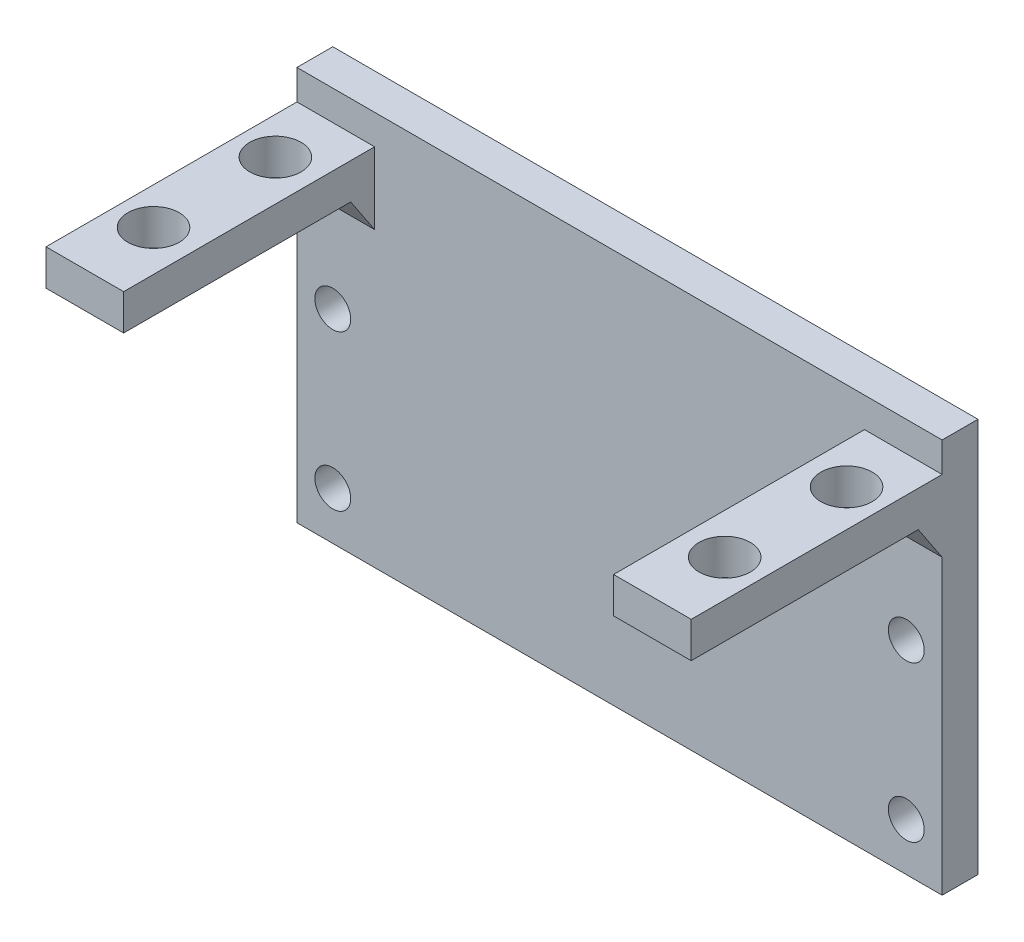
ISO-10303-21;
HEADER;
FILE_DESCRIPTION(('STEP AP214'),'2;1');
FILE_NAME('part.step','',(''),(''),'','','');
FILE_SCHEMA(('AUTOMOTIVE_DESIGN { 1 0 10303 214 1 1 1 1 }'));
ENDSEC;
DATA;
#1=APPLICATION_CONTEXT('core data for automotive mechanical design processes');
#2=APPLICATION_PROTOCOL_DEFINITION('international standard','automotive_design',2000,#1);
#3=PRODUCT_CONTEXT('',#1,'mechanical');
#4=PRODUCT('Part','Part','',(#3));
#5=PRODUCT_RELATED_PRODUCT_CATEGORY('part','',(#4));
#6=PRODUCT_DEFINITION_FORMATION('','',#4);
#7=PRODUCT_DEFINITION_CONTEXT('part definition',#1,'design');
#8=PRODUCT_DEFINITION('design','',#6,#7);
#9=PRODUCT_DEFINITION_SHAPE('','',#8);
#10=(LENGTH_UNIT() NAMED_UNIT(*) SI_UNIT(.MILLI.,.METRE.));
#11=(NAMED_UNIT(*) PLANE_ANGLE_UNIT() SI_UNIT($,.RADIAN.));
#12=(NAMED_UNIT(*) SI_UNIT($,.STERADIAN.) SOLID_ANGLE_UNIT());
#13=UNCERTAINTY_MEASURE_WITH_UNIT(LENGTH_MEASURE(1.E-05),#10,'distance_accuracy_value','');
#14=(GEOMETRIC_REPRESENTATION_CONTEXT(3) GLOBAL_UNCERTAINTY_ASSIGNED_CONTEXT((#13)) GLOBAL_UNIT_ASSIGNED_CONTEXT((#10,
#11,#12)) REPRESENTATION_CONTEXT('',''));
#15=CARTESIAN_POINT('',(0.,0.,0.));
#16=DIRECTION('',(0.,0.,1.));
#17=DIRECTION('',(1.,0.,0.));
#18=AXIS2_PLACEMENT_3D('',#15,#16,#17);
#19=CARTESIAN_POINT('',(0.,0.,3.));
#20=DIRECTION('',(0.,0.,1.));
#21=DIRECTION('',(1.,0.,0.));
#22=AXIS2_PLACEMENT_3D('',#19,#20,#21);
#23=PLANE('',#22);
#24=DIRECTION('',(-1.,0.,0.));
#25=VECTOR('',#24,1.);
#26=CARTESIAN_POINT('',(-9.45332964332359,0.892525525959512,3.));
#27=LINE('',#26,#25);
#28=CARTESIAN_POINT('',(-13.0588809187876,0.892525525959512,3.));
#29=VERTEX_POINT('',#28);
#30=CARTESIAN_POINT('',(-19.5588809187876,0.892525525959511,3.));
#31=VERTEX_POINT('',#30);
#32=EDGE_CURVE('E151',#29,#31,#27,.T.);
#33=ORIENTED_EDGE('',*,*,#32,.T.);
#34=DIRECTION('',(0.,-1.,0.));
#35=VECTOR('',#34,1.);
#36=CARTESIAN_POINT('',(-19.5588809187876,9.39252552595941,3.));
#37=LINE('',#36,#35);
#38=CARTESIAN_POINT('',(-19.5588809187876,-23.6074744740404,3.));
#39=VERTEX_POINT('',#38);
#40=EDGE_CURVE('E160',#31,#39,#37,.T.);
#41=ORIENTED_EDGE('',*,*,#40,.T.);
#42=DIRECTION('',(1.,0.,0.));
#43=VECTOR('',#42,1.);
#44=CARTESIAN_POINT('',(-19.5588809187876,-23.6074744740404,3.));
#45=LINE('',#44,#43);
#46=CARTESIAN_POINT('',(34.4411190812124,-23.6074744740404,3.));
#47=VERTEX_POINT('',#46);
#48=EDGE_CURVE('E207',#39,#47,#45,.T.);
#49=ORIENTED_EDGE('',*,*,#48,.T.);
#50=DIRECTION('',(0.,1.,0.));
#51=VECTOR('',#50,1.);
#52=CARTESIAN_POINT('',(34.4411190812124,9.39252552595941,3.));
#53=LINE('',#52,#51);
#54=CARTESIAN_POINT('',(34.4411190812124,0.892525525959515,3.));
#55=VERTEX_POINT('',#54);
#56=EDGE_CURVE('E60',#47,#55,#53,.T.);
#57=ORIENTED_EDGE('',*,*,#56,.T.);
#58=DIRECTION('',(1.,0.,0.));
#59=VECTOR('',#58,1.);
#60=CARTESIAN_POINT('',(24.3355678057484,0.892525525959516,3.));
#61=LINE('',#60,#59);
#62=CARTESIAN_POINT('',(27.9411190812124,0.892525525959518,3.));
#63=VERTEX_POINT('',#62);
#64=EDGE_CURVE('E351',#63,#55,#61,.T.);
#65=ORIENTED_EDGE('',*,*,#64,.F.);
#66=DIRECTION('',(0.,-1.,0.));
#67=VECTOR('',#66,1.);
#68=CARTESIAN_POINT('',(27.9411190812124,6.89252552595952,3.));
#69=LINE('',#68,#67);
#70=CARTESIAN_POINT('',(27.9411190812124,6.89252552595952,3.));
#71=VERTEX_POINT('',#70);
#72=EDGE_CURVE('E53',#71,#63,#69,.T.);
#73=ORIENTED_EDGE('',*,*,#72,.F.);
#74=DIRECTION('',(-1.,0.,0.));
#75=VECTOR('',#74,1.);
#76=CARTESIAN_POINT('',(34.4411190812124,6.89252552595952,3.));
#77=LINE('',#76,#75);
#78=CARTESIAN_POINT('',(34.4411190812124,6.89252552595952,3.));
#79=VERTEX_POINT('',#78);
#80=EDGE_CURVE('E181',#79,#71,#77,.T.);
#81=ORIENTED_EDGE('',*,*,#80,.F.);
#82=CARTESIAN_POINT('',(34.4411190812124,9.39252552595941,3.));
#83=VERTEX_POINT('',#82);
#84=EDGE_CURVE('E209',#79,#83,#53,.T.);
#85=ORIENTED_EDGE('',*,*,#84,.T.);
#86=DIRECTION('',(-1.,0.,0.));
#87=VECTOR('',#86,1.);
#88=CARTESIAN_POINT('',(-19.5588809187876,9.39252552595941,3.));
#89=LINE('',#88,#87);
#90=CARTESIAN_POINT('',(-19.5588809187876,9.39252552595941,3.));
#91=VERTEX_POINT('',#90);
#92=EDGE_CURVE('E211',#83,#91,#89,.T.);
#93=ORIENTED_EDGE('',*,*,#92,.T.);
#94=CARTESIAN_POINT('',(-19.5588809187876,6.89252552595951,3.));
#95=VERTEX_POINT('',#94);
#96=EDGE_CURVE('E205',#91,#95,#37,.T.);
#97=ORIENTED_EDGE('',*,*,#96,.T.);
#98=DIRECTION('',(-1.,0.,0.));
#99=VECTOR('',#98,1.);
#100=CARTESIAN_POINT('',(-19.5588809187876,6.89252552595951,3.));
#101=LINE('',#100,#99);
#102=CARTESIAN_POINT('',(-13.0588809187876,6.89252552595951,3.));
#103=VERTEX_POINT('',#102);
#104=EDGE_CURVE('E174',#103,#95,#101,.T.);
#105=ORIENTED_EDGE('',*,*,#104,.F.);
#106=DIRECTION('',(0.,1.,0.));
#107=VECTOR('',#106,1.);
#108=CARTESIAN_POINT('',(-13.0588809187876,6.89252552595951,3.));
#109=LINE('',#108,#107);
#110=EDGE_CURVE('E271',#29,#103,#109,.T.);
#111=ORIENTED_EDGE('',*,*,#110,.F.);
#112=EDGE_LOOP('',(#33,#41,#49,#57,#65,#73,#81,#85,#93,#97,#105,#111));
#113=FACE_BOUND('',#112,.T.);
#114=CARTESIAN_POINT('',(31.4411190812124,-6.60747447404044,3.));
#115=DIRECTION('',(0.,0.,1.));
#116=DIRECTION('',(1.,0.,0.));
#117=AXIS2_PLACEMENT_3D('',#114,#115,#116);
#118=CIRCLE('',#117,1.5);
#119=CARTESIAN_POINT('',(32.9411190812124,-6.60747447404044,3.));
#120=VERTEX_POINT('',#119);
#121=EDGE_CURVE('E364',#120,#120,#118,.T.);
#122=ORIENTED_EDGE('',*,*,#121,.F.);
#123=EDGE_LOOP('',(#122));
#124=FACE_BOUND('',#123,.T.);
#125=CARTESIAN_POINT('',(-16.5588809187876,-6.60747447404044,3.));
#126=DIRECTION('',(0.,0.,1.));
#127=DIRECTION('',(1.,0.,0.));
#128=AXIS2_PLACEMENT_3D('',#125,#126,#127);
#129=CIRCLE('',#128,1.5);
#130=CARTESIAN_POINT('',(-15.0588809187876,-6.60747447404044,3.));
#131=VERTEX_POINT('',#130);
#132=EDGE_CURVE('E362',#131,#131,#129,.T.);
#133=ORIENTED_EDGE('',*,*,#132,.F.);
#134=EDGE_LOOP('',(#133));
#135=FACE_BOUND('',#134,.T.);
#136=CARTESIAN_POINT('',(-16.5588809187876,-19.6074744740404,3.));
#137=DIRECTION('',(0.,0.,1.));
#138=DIRECTION('',(1.,0.,0.));
#139=AXIS2_PLACEMENT_3D('',#136,#137,#138);
#140=CIRCLE('',#139,1.5);
#141=CARTESIAN_POINT('',(-15.0588809187876,-19.6074744740404,3.));
#142=VERTEX_POINT('',#141);
#143=EDGE_CURVE('E359',#142,#142,#140,.T.);
#144=ORIENTED_EDGE('',*,*,#143,.F.);
#145=EDGE_LOOP('',(#144));
#146=FACE_BOUND('',#145,.T.);
#147=CARTESIAN_POINT('',(31.4411190812124,-19.6074744740404,3.));
#148=DIRECTION('',(0.,0.,1.));
#149=DIRECTION('',(1.,0.,0.));
#150=AXIS2_PLACEMENT_3D('',#147,#148,#149);
#151=CIRCLE('',#150,1.50000000000001);
#152=CARTESIAN_POINT('',(32.9411190812124,-19.6074744740404,3.));
#153=VERTEX_POINT('',#152);
#154=EDGE_CURVE('E233',#153,#153,#151,.T.);
#155=ORIENTED_EDGE('',*,*,#154,.F.);
#156=EDGE_LOOP('',(#155));
#157=FACE_BOUND('',#156,.T.);
#158=ADVANCED_FACE('F36',(#113,#124,#135,#146,#157),#23,.T.);
#159=CARTESIAN_POINT('',(-19.5588809187876,9.39252552595941,3.));
#160=DIRECTION('',(1.,0.,0.));
#161=DIRECTION('',(0.,1.,0.));
#162=AXIS2_PLACEMENT_3D('',#159,#160,#161);
#163=PLANE('',#162);
#164=ORIENTED_EDGE('',*,*,#40,.F.);
#165=DIRECTION('',(0.,0.832050294337844,0.554700196225229));
#166=VECTOR('',#165,1.);
#167=CARTESIAN_POINT('',(-19.5588809187876,0.892525525959511,3.));
#168=LINE('',#167,#166);
#169=CARTESIAN_POINT('',(-19.5588809187876,3.89252552595951,5.));
#170=VERTEX_POINT('',#169);
#171=EDGE_CURVE('E143',#31,#170,#168,.T.);
#172=ORIENTED_EDGE('',*,*,#171,.T.);
#173=DIRECTION('',(0.,0.,-1.));
#174=VECTOR('',#173,1.);
#175=CARTESIAN_POINT('',(-19.5588809187876,3.89252552595951,24.));
#176=LINE('',#175,#174);
#177=CARTESIAN_POINT('',(-19.5588809187876,3.89252552595951,24.));
#178=VERTEX_POINT('',#177);
#179=EDGE_CURVE('E157',#178,#170,#176,.T.);
#180=ORIENTED_EDGE('',*,*,#179,.F.);
#181=DIRECTION('',(0.,-1.,0.));
#182=VECTOR('',#181,1.);
#183=CARTESIAN_POINT('',(-19.5588809187876,3.89252552595951,24.));
#184=LINE('',#183,#182);
#185=CARTESIAN_POINT('',(-19.5588809187876,6.89252552595951,24.));
#186=VERTEX_POINT('',#185);
#187=EDGE_CURVE('E166',#186,#178,#184,.T.);
#188=ORIENTED_EDGE('',*,*,#187,.F.);
#189=DIRECTION('',(0.,0.,-1.));
#190=VECTOR('',#189,1.);
#191=CARTESIAN_POINT('',(-19.5588809187876,6.89252552595951,24.));
#192=LINE('',#191,#190);
#193=EDGE_CURVE('E165',#186,#95,#192,.T.);
#194=ORIENTED_EDGE('',*,*,#193,.T.);
#195=ORIENTED_EDGE('',*,*,#96,.F.);
#196=DIRECTION('',(0.,0.,-1.));
#197=VECTOR('',#196,1.);
#198=CARTESIAN_POINT('',(-19.5588809187876,9.39252552595941,3.));
#199=LINE('',#198,#197);
#200=CARTESIAN_POINT('',(-19.5588809187876,9.39252552595941,0.));
#201=VERTEX_POINT('',#200);
#202=EDGE_CURVE('E213',#91,#201,#199,.T.);
#203=ORIENTED_EDGE('',*,*,#202,.T.);
#204=DIRECTION('',(0.,-1.,0.));
#205=VECTOR('',#204,1.);
#206=CARTESIAN_POINT('',(-19.5588809187876,9.39252552595941,0.));
#207=LINE('',#206,#205);
#208=CARTESIAN_POINT('',(-19.5588809187876,-23.6074744740404,0.));
#209=VERTEX_POINT('',#208);
#210=EDGE_CURVE('E204',#201,#209,#207,.T.);
#211=ORIENTED_EDGE('',*,*,#210,.T.);
#212=DIRECTION('',(0.,0.,-1.));
#213=VECTOR('',#212,1.);
#214=CARTESIAN_POINT('',(-19.5588809187876,-23.6074744740404,3.));
#215=LINE('',#214,#213);
#216=EDGE_CURVE('E11',#39,#209,#215,.T.);
#217=ORIENTED_EDGE('',*,*,#216,.F.);
#218=EDGE_LOOP('',(#164,#172,#180,#188,#194,#195,#203,#211,#217));
#219=FACE_BOUND('',#218,.T.);
#220=ADVANCED_FACE('F38',(#219),#163,.F.);
#221=CARTESIAN_POINT('',(-19.5588809187876,-23.6074744740404,3.));
#222=DIRECTION('',(0.,1.,0.));
#223=DIRECTION('',(0.,0.,1.));
#224=AXIS2_PLACEMENT_3D('',#221,#222,#223);
#225=PLANE('',#224);
#226=DIRECTION('',(1.,0.,0.));
#227=VECTOR('',#226,1.);
#228=CARTESIAN_POINT('',(-19.5588809187876,-23.6074744740404,0.));
#229=LINE('',#228,#227);
#230=CARTESIAN_POINT('',(34.4411190812124,-23.6074744740404,0.));
#231=VERTEX_POINT('',#230);
#232=EDGE_CURVE('E216',#209,#231,#229,.T.);
#233=ORIENTED_EDGE('',*,*,#232,.T.);
#234=DIRECTION('',(0.,0.,-1.));
#235=VECTOR('',#234,1.);
#236=CARTESIAN_POINT('',(34.4411190812124,-23.6074744740404,3.));
#237=LINE('',#236,#235);
#238=EDGE_CURVE('E45',#47,#231,#237,.T.);
#239=ORIENTED_EDGE('',*,*,#238,.F.);
#240=ORIENTED_EDGE('',*,*,#48,.F.);
#241=ORIENTED_EDGE('',*,*,#216,.T.);
#242=EDGE_LOOP('',(#233,#239,#240,#241));
#243=FACE_BOUND('',#242,.T.);
#244=ADVANCED_FACE('F303',(#243),#225,.F.);
#245=CARTESIAN_POINT('',(34.4411190812124,9.39252552595941,3.));
#246=DIRECTION('',(-1.,0.,0.));
#247=DIRECTION('',(0.,-1.,0.));
#248=AXIS2_PLACEMENT_3D('',#245,#246,#247);
#249=PLANE('',#248);
#250=DIRECTION('',(0.,1.,0.));
#251=VECTOR('',#250,1.);
#252=CARTESIAN_POINT('',(34.4411190812124,9.39252552595941,0.));
#253=LINE('',#252,#251);
#254=CARTESIAN_POINT('',(34.4411190812124,9.39252552595941,0.));
#255=VERTEX_POINT('',#254);
#256=EDGE_CURVE('E218',#231,#255,#253,.T.);
#257=ORIENTED_EDGE('',*,*,#256,.T.);
#258=DIRECTION('',(0.,0.,-1.));
#259=VECTOR('',#258,1.);
#260=CARTESIAN_POINT('',(34.4411190812124,9.39252552595941,3.));
#261=LINE('',#260,#259);
#262=EDGE_CURVE('E224',#83,#255,#261,.T.);
#263=ORIENTED_EDGE('',*,*,#262,.F.);
#264=ORIENTED_EDGE('',*,*,#84,.F.);
#265=DIRECTION('',(0.,0.,-1.));
#266=VECTOR('',#265,1.);
#267=CARTESIAN_POINT('',(34.4411190812124,6.89252552595952,24.));
#268=LINE('',#267,#266);
#269=CARTESIAN_POINT('',(34.4411190812124,6.89252552595952,24.));
#270=VERTEX_POINT('',#269);
#271=EDGE_CURVE('E191',#270,#79,#268,.T.);
#272=ORIENTED_EDGE('',*,*,#271,.F.);
#273=DIRECTION('',(0.,1.,0.));
#274=VECTOR('',#273,1.);
#275=CARTESIAN_POINT('',(34.4411190812124,3.89252552595952,24.));
#276=LINE('',#275,#274);
#277=CARTESIAN_POINT('',(34.4411190812124,3.89252552595952,24.));
#278=VERTEX_POINT('',#277);
#279=EDGE_CURVE('E189',#278,#270,#276,.T.);
#280=ORIENTED_EDGE('',*,*,#279,.F.);
#281=DIRECTION('',(0.,0.,-1.));
#282=VECTOR('',#281,1.);
#283=CARTESIAN_POINT('',(34.4411190812124,3.89252552595952,24.));
#284=LINE('',#283,#282);
#285=CARTESIAN_POINT('',(34.4411190812124,3.89252552595952,5.));
#286=VERTEX_POINT('',#285);
#287=EDGE_CURVE('E197',#278,#286,#284,.T.);
#288=ORIENTED_EDGE('',*,*,#287,.T.);
#289=DIRECTION('',(0.,-0.832050294337843,-0.554700196225229));
#290=VECTOR('',#289,1.);
#291=CARTESIAN_POINT('',(34.4411190812124,0.892525525959518,3.));
#292=LINE('',#291,#290);
#293=EDGE_CURVE('E344',#286,#55,#292,.T.);
#294=ORIENTED_EDGE('',*,*,#293,.T.);
#295=ORIENTED_EDGE('',*,*,#56,.F.);
#296=ORIENTED_EDGE('',*,*,#238,.T.);
#297=EDGE_LOOP('',(#257,#263,#264,#272,#280,#288,#294,#295,#296));
#298=FACE_BOUND('',#297,.T.);
#299=ADVANCED_FACE('F315',(#298),#249,.F.);
#300=CARTESIAN_POINT('',(-19.5588809187876,9.39252552595941,3.));
#301=DIRECTION('',(0.,-1.,0.));
#302=DIRECTION('',(0.,0.,-1.));
#303=AXIS2_PLACEMENT_3D('',#300,#301,#302);
#304=PLANE('',#303);
#305=DIRECTION('',(-1.,0.,0.));
#306=VECTOR('',#305,1.);
#307=CARTESIAN_POINT('',(-19.5588809187876,9.39252552595941,0.));
#308=LINE('',#307,#306);
#309=EDGE_CURVE('E220',#255,#201,#308,.T.);
#310=ORIENTED_EDGE('',*,*,#309,.T.);
#311=ORIENTED_EDGE('',*,*,#202,.F.);
#312=ORIENTED_EDGE('',*,*,#92,.F.);
#313=ORIENTED_EDGE('',*,*,#262,.T.);
#314=EDGE_LOOP('',(#310,#311,#312,#313));
#315=FACE_BOUND('',#314,.T.);
#316=ADVANCED_FACE('F312',(#315),#304,.F.);
#317=CARTESIAN_POINT('',(0.,0.,0.));
#318=DIRECTION('',(0.,0.,1.));
#319=DIRECTION('',(1.,0.,0.));
#320=AXIS2_PLACEMENT_3D('',#317,#318,#319);
#321=PLANE('',#320);
#322=CARTESIAN_POINT('',(31.4411190812124,-6.60747447404044,0.));
#323=DIRECTION('',(0.,0.,1.));
#324=DIRECTION('',(1.,0.,0.));
#325=AXIS2_PLACEMENT_3D('',#322,#323,#324);
#326=CIRCLE('',#325,1.5);
#327=CARTESIAN_POINT('',(32.9411190812124,-6.60747447404044,0.));
#328=VERTEX_POINT('',#327);
#329=EDGE_CURVE('E40',#328,#328,#326,.T.);
#330=ORIENTED_EDGE('',*,*,#329,.T.);
#331=EDGE_LOOP('',(#330));
#332=FACE_BOUND('',#331,.T.);
#333=CARTESIAN_POINT('',(-16.5588809187876,-6.60747447404044,0.));
#334=DIRECTION('',(0.,0.,1.));
#335=DIRECTION('',(1.,0.,0.));
#336=AXIS2_PLACEMENT_3D('',#333,#334,#335);
#337=CIRCLE('',#336,1.5);
#338=CARTESIAN_POINT('',(-15.0588809187876,-6.60747447404044,0.));
#339=VERTEX_POINT('',#338);
#340=EDGE_CURVE('E235',#339,#339,#337,.T.);
#341=ORIENTED_EDGE('',*,*,#340,.T.);
#342=EDGE_LOOP('',(#341));
#343=FACE_BOUND('',#342,.T.);
#344=CARTESIAN_POINT('',(-16.5588809187876,-19.6074744740404,0.));
#345=DIRECTION('',(0.,0.,1.));
#346=DIRECTION('',(1.,0.,0.));
#347=AXIS2_PLACEMENT_3D('',#344,#345,#346);
#348=CIRCLE('',#347,1.5);
#349=CARTESIAN_POINT('',(-15.0588809187876,-19.6074744740404,0.));
#350=VERTEX_POINT('',#349);
#351=EDGE_CURVE('E232',#350,#350,#348,.T.);
#352=ORIENTED_EDGE('',*,*,#351,.T.);
#353=EDGE_LOOP('',(#352));
#354=FACE_BOUND('',#353,.T.);
#355=CARTESIAN_POINT('',(31.4411190812124,-19.6074744740404,0.));
#356=DIRECTION('',(0.,0.,1.));
#357=DIRECTION('',(1.,0.,0.));
#358=AXIS2_PLACEMENT_3D('',#355,#356,#357);
#359=CIRCLE('',#358,1.50000000000001);
#360=CARTESIAN_POINT('',(32.9411190812124,-19.6074744740404,0.));
#361=VERTEX_POINT('',#360);
#362=EDGE_CURVE('E229',#361,#361,#359,.T.);
#363=ORIENTED_EDGE('',*,*,#362,.T.);
#364=EDGE_LOOP('',(#363));
#365=FACE_BOUND('',#364,.T.);
#366=ORIENTED_EDGE('',*,*,#210,.F.);
#367=ORIENTED_EDGE('',*,*,#309,.F.);
#368=ORIENTED_EDGE('',*,*,#256,.F.);
#369=ORIENTED_EDGE('',*,*,#232,.F.);
#370=EDGE_LOOP('',(#366,#367,#368,#369));
#371=FACE_BOUND('',#370,.T.);
#372=ADVANCED_FACE('F309',(#332,#343,#354,#365,#371),#321,.F.);
#373=CARTESIAN_POINT('',(34.4411190812124,6.89252552595952,24.));
#374=DIRECTION('',(0.,-1.,0.));
#375=DIRECTION('',(0.,0.,-1.));
#376=AXIS2_PLACEMENT_3D('',#373,#374,#375);
#377=PLANE('',#376);
#378=CARTESIAN_POINT('',(31.3411190812124,6.89252552595952,7.9));
#379=DIRECTION('',(0.,1.,0.));
#380=DIRECTION('',(0.,0.,1.));
#381=AXIS2_PLACEMENT_3D('',#378,#379,#380);
#382=CIRCLE('',#381,2.14999999999999);
#383=CARTESIAN_POINT('',(31.3411190812124,6.89252552595952,10.05));
#384=VERTEX_POINT('',#383);
#385=EDGE_CURVE('E254',#384,#384,#382,.T.);
#386=ORIENTED_EDGE('',*,*,#385,.F.);
#387=EDGE_LOOP('',(#386));
#388=FACE_BOUND('',#387,.T.);
#389=CARTESIAN_POINT('',(31.3411190812124,6.89252552595952,18.1));
#390=DIRECTION('',(0.,1.,0.));
#391=DIRECTION('',(0.,0.,1.));
#392=AXIS2_PLACEMENT_3D('',#389,#390,#391);
#393=CIRCLE('',#392,2.15);
#394=CARTESIAN_POINT('',(31.3411190812124,6.89252552595952,20.25));
#395=VERTEX_POINT('',#394);
#396=EDGE_CURVE('E261',#395,#395,#393,.T.);
#397=ORIENTED_EDGE('',*,*,#396,.F.);
#398=EDGE_LOOP('',(#397));
#399=FACE_BOUND('',#398,.T.);
#400=ORIENTED_EDGE('',*,*,#80,.T.);
#401=DIRECTION('',(0.,0.,-1.));
#402=VECTOR('',#401,1.);
#403=CARTESIAN_POINT('',(27.9411190812124,6.89252552595952,24.));
#404=LINE('',#403,#402);
#405=CARTESIAN_POINT('',(27.9411190812124,6.89252552595952,24.));
#406=VERTEX_POINT('',#405);
#407=EDGE_CURVE('E202',#406,#71,#404,.T.);
#408=ORIENTED_EDGE('',*,*,#407,.F.);
#409=DIRECTION('',(-1.,0.,0.));
#410=VECTOR('',#409,1.);
#411=CARTESIAN_POINT('',(34.4411190812124,6.89252552595952,24.));
#412=LINE('',#411,#410);
#413=EDGE_CURVE('E182',#270,#406,#412,.T.);
#414=ORIENTED_EDGE('',*,*,#413,.F.);
#415=ORIENTED_EDGE('',*,*,#271,.T.);
#416=EDGE_LOOP('',(#400,#408,#414,#415));
#417=FACE_BOUND('',#416,.T.);
#418=ADVANCED_FACE('F307',(#388,#399,#417),#377,.F.);
#419=CARTESIAN_POINT('',(27.9411190812124,6.89252552595952,24.));
#420=DIRECTION('',(1.,0.,0.));
#421=DIRECTION('',(0.,1.,0.));
#422=AXIS2_PLACEMENT_3D('',#419,#420,#421);
#423=PLANE('',#422);
#424=ORIENTED_EDGE('',*,*,#72,.T.);
#425=DIRECTION('',(0.,0.832050294337844,0.554700196225229));
#426=VECTOR('',#425,1.);
#427=CARTESIAN_POINT('',(27.9411190812124,0.892525525959519,3.));
#428=LINE('',#427,#426);
#429=CARTESIAN_POINT('',(27.9411190812124,3.89252552595952,5.));
#430=VERTEX_POINT('',#429);
#431=EDGE_CURVE('E357',#63,#430,#428,.T.);
#432=ORIENTED_EDGE('',*,*,#431,.T.);
#433=DIRECTION('',(0.,0.,-1.));
#434=VECTOR('',#433,1.);
#435=CARTESIAN_POINT('',(27.9411190812124,3.89252552595952,24.));
#436=LINE('',#435,#434);
#437=CARTESIAN_POINT('',(27.9411190812124,3.89252552595952,24.));
#438=VERTEX_POINT('',#437);
#439=EDGE_CURVE('E200',#438,#430,#436,.T.);
#440=ORIENTED_EDGE('',*,*,#439,.F.);
#441=DIRECTION('',(0.,-1.,0.));
#442=VECTOR('',#441,1.);
#443=CARTESIAN_POINT('',(27.9411190812124,6.89252552595952,24.));
#444=LINE('',#443,#442);
#445=EDGE_CURVE('E185',#406,#438,#444,.T.);
#446=ORIENTED_EDGE('',*,*,#445,.F.);
#447=ORIENTED_EDGE('',*,*,#407,.T.);
#448=EDGE_LOOP('',(#424,#432,#440,#446,#447));
#449=FACE_BOUND('',#448,.T.);
#450=ADVANCED_FACE('F368',(#449),#423,.F.);
#451=CARTESIAN_POINT('',(27.9411190812124,3.89252552595952,24.));
#452=DIRECTION('',(0.,1.,0.));
#453=DIRECTION('',(0.,0.,1.));
#454=AXIS2_PLACEMENT_3D('',#451,#452,#453);
#455=PLANE('',#454);
#456=CARTESIAN_POINT('',(31.3411190812124,3.89252552595952,7.9));
#457=DIRECTION('',(0.,1.,0.));
#458=DIRECTION('',(-1.,0.,0.));
#459=AXIS2_PLACEMENT_3D('',#456,#457,#458);
#460=CIRCLE('',#459,2.14999999999999);
#461=CARTESIAN_POINT('',(29.1911190812124,3.89252552595952,7.9));
#462=VERTEX_POINT('',#461);
#463=EDGE_CURVE('E257',#462,#462,#460,.F.);
#464=ORIENTED_EDGE('',*,*,#463,.F.);
#465=EDGE_LOOP('',(#464));
#466=FACE_BOUND('',#465,.T.);
#467=CARTESIAN_POINT('',(31.3411190812124,3.89252552595952,18.1));
#468=DIRECTION('',(0.,1.,0.));
#469=DIRECTION('',(-1.,0.,0.));
#470=AXIS2_PLACEMENT_3D('',#467,#468,#469);
#471=CIRCLE('',#470,2.15);
#472=CARTESIAN_POINT('',(29.1911190812124,3.89252552595952,18.1));
#473=VERTEX_POINT('',#472);
#474=EDGE_CURVE('E268',#473,#473,#471,.F.);
#475=ORIENTED_EDGE('',*,*,#474,.F.);
#476=EDGE_LOOP('',(#475));
#477=FACE_BOUND('',#476,.T.);
#478=ORIENTED_EDGE('',*,*,#439,.T.);
#479=DIRECTION('',(1.,0.,0.));
#480=VECTOR('',#479,1.);
#481=CARTESIAN_POINT('',(24.3355678057484,3.89252552595952,5.));
#482=LINE('',#481,#480);
#483=EDGE_CURVE('E350',#430,#286,#482,.T.);
#484=ORIENTED_EDGE('',*,*,#483,.T.);
#485=ORIENTED_EDGE('',*,*,#287,.F.);
#486=DIRECTION('',(1.,0.,0.));
#487=VECTOR('',#486,1.);
#488=CARTESIAN_POINT('',(27.9411190812124,3.89252552595952,24.));
#489=LINE('',#488,#487);
#490=EDGE_CURVE('E187',#438,#278,#489,.T.);
#491=ORIENTED_EDGE('',*,*,#490,.F.);
#492=EDGE_LOOP('',(#478,#484,#485,#491));
#493=FACE_BOUND('',#492,.T.);
#494=ADVANCED_FACE('F369',(#466,#477,#493),#455,.F.);
#495=CARTESIAN_POINT('',(0.,0.,24.));
#496=DIRECTION('',(0.,0.,1.));
#497=DIRECTION('',(1.,0.,0.));
#498=AXIS2_PLACEMENT_3D('',#495,#496,#497);
#499=PLANE('',#498);
#500=ORIENTED_EDGE('',*,*,#413,.T.);
#501=ORIENTED_EDGE('',*,*,#445,.T.);
#502=ORIENTED_EDGE('',*,*,#490,.T.);
#503=ORIENTED_EDGE('',*,*,#279,.T.);
#504=EDGE_LOOP('',(#500,#501,#502,#503));
#505=FACE_BOUND('',#504,.T.);
#506=ADVANCED_FACE('F295',(#505),#499,.T.);
#507=CARTESIAN_POINT('',(-13.0588809187876,3.89252552595951,24.));
#508=DIRECTION('',(0.,1.,0.));
#509=DIRECTION('',(-1.,0.,0.));
#510=AXIS2_PLACEMENT_3D('',#507,#508,#509);
#511=PLANE('',#510);
#512=CARTESIAN_POINT('',(-16.4588809187876,3.89252552595951,18.1));
#513=DIRECTION('',(0.,1.,0.));
#514=DIRECTION('',(-1.,0.,0.));
#515=AXIS2_PLACEMENT_3D('',#512,#513,#514);
#516=CIRCLE('',#515,2.15);
#517=CARTESIAN_POINT('',(-18.6088809187876,3.89252552595951,18.1));
#518=VERTEX_POINT('',#517);
#519=EDGE_CURVE('E258',#518,#518,#516,.F.);
#520=ORIENTED_EDGE('',*,*,#519,.F.);
#521=EDGE_LOOP('',(#520));
#522=FACE_BOUND('',#521,.T.);
#523=CARTESIAN_POINT('',(-16.4588809187876,3.89252552595951,7.90000000000005));
#524=DIRECTION('',(0.,1.,0.));
#525=DIRECTION('',(-1.,0.,0.));
#526=AXIS2_PLACEMENT_3D('',#523,#524,#525);
#527=CIRCLE('',#526,2.15);
#528=CARTESIAN_POINT('',(-18.6088809187876,3.89252552595951,7.90000000000005));
#529=VERTEX_POINT('',#528);
#530=EDGE_CURVE('E244',#529,#529,#527,.F.);
#531=ORIENTED_EDGE('',*,*,#530,.F.);
#532=EDGE_LOOP('',(#531));
#533=FACE_BOUND('',#532,.T.);
#534=ORIENTED_EDGE('',*,*,#179,.T.);
#535=DIRECTION('',(-1.,0.,0.));
#536=VECTOR('',#535,1.);
#537=CARTESIAN_POINT('',(-9.45332964332359,3.89252552595951,5.));
#538=LINE('',#537,#536);
#539=CARTESIAN_POINT('',(-13.0588809187876,3.89252552595951,5.));
#540=VERTEX_POINT('',#539);
#541=EDGE_CURVE('E139',#540,#170,#538,.T.);
#542=ORIENTED_EDGE('',*,*,#541,.F.);
#543=DIRECTION('',(0.,0.,-1.));
#544=VECTOR('',#543,1.);
#545=CARTESIAN_POINT('',(-13.0588809187876,3.89252552595951,24.));
#546=LINE('',#545,#544);
#547=CARTESIAN_POINT('',(-13.0588809187876,3.89252552595951,24.));
#548=VERTEX_POINT('',#547);
#549=EDGE_CURVE('E179',#548,#540,#546,.T.);
#550=ORIENTED_EDGE('',*,*,#549,.F.);
#551=DIRECTION('',(1.,0.,0.));
#552=VECTOR('',#551,1.);
#553=CARTESIAN_POINT('',(-13.0588809187876,3.89252552595951,24.));
#554=LINE('',#553,#552);
#555=EDGE_CURVE('E164',#178,#548,#554,.T.);
#556=ORIENTED_EDGE('',*,*,#555,.F.);
#557=EDGE_LOOP('',(#534,#542,#550,#556));
#558=FACE_BOUND('',#557,.T.);
#559=ADVANCED_FACE('F162',(#522,#533,#558),#511,.F.);
#560=CARTESIAN_POINT('',(-13.0588809187876,6.89252552595951,24.));
#561=DIRECTION('',(-1.,0.,0.));
#562=DIRECTION('',(0.,-1.,0.));
#563=AXIS2_PLACEMENT_3D('',#560,#561,#562);
#564=PLANE('',#563);
#565=ORIENTED_EDGE('',*,*,#110,.T.);
#566=DIRECTION('',(0.,0.,-1.));
#567=VECTOR('',#566,1.);
#568=CARTESIAN_POINT('',(-13.0588809187876,6.89252552595951,24.));
#569=LINE('',#568,#567);
#570=CARTESIAN_POINT('',(-13.0588809187876,6.89252552595951,24.));
#571=VERTEX_POINT('',#570);
#572=EDGE_CURVE('E169',#571,#103,#569,.T.);
#573=ORIENTED_EDGE('',*,*,#572,.F.);
#574=DIRECTION('',(0.,1.,0.));
#575=VECTOR('',#574,1.);
#576=CARTESIAN_POINT('',(-13.0588809187876,6.89252552595951,24.));
#577=LINE('',#576,#575);
#578=EDGE_CURVE('E273',#548,#571,#577,.T.);
#579=ORIENTED_EDGE('',*,*,#578,.F.);
#580=ORIENTED_EDGE('',*,*,#549,.T.);
#581=DIRECTION('',(0.,-0.832050294337844,-0.554700196225229));
#582=VECTOR('',#581,1.);
#583=CARTESIAN_POINT('',(-13.0588809187876,0.892525525959509,3.));
#584=LINE('',#583,#582);
#585=EDGE_CURVE('E146',#540,#29,#584,.T.);
#586=ORIENTED_EDGE('',*,*,#585,.T.);
#587=EDGE_LOOP('',(#565,#573,#579,#580,#586));
#588=FACE_BOUND('',#587,.T.);
#589=ADVANCED_FACE('F286',(#588),#564,.F.);
#590=CARTESIAN_POINT('',(-19.5588809187876,6.89252552595951,24.));
#591=DIRECTION('',(0.,-1.,0.));
#592=DIRECTION('',(1.,0.,0.));
#593=AXIS2_PLACEMENT_3D('',#590,#591,#592);
#594=PLANE('',#593);
#595=CARTESIAN_POINT('',(-16.4588809187876,6.89252552595952,18.1));
#596=DIRECTION('',(0.,1.,0.));
#597=DIRECTION('',(0.,0.,1.));
#598=AXIS2_PLACEMENT_3D('',#595,#596,#597);
#599=CIRCLE('',#598,2.15);
#600=CARTESIAN_POINT('',(-16.4588809187876,6.89252552595952,20.25));
#601=VERTEX_POINT('',#600);
#602=EDGE_CURVE('E249',#601,#601,#599,.T.);
#603=ORIENTED_EDGE('',*,*,#602,.F.);
#604=EDGE_LOOP('',(#603));
#605=FACE_BOUND('',#604,.T.);
#606=CARTESIAN_POINT('',(-16.4588809187876,6.89252552595952,7.90000000000005));
#607=DIRECTION('',(0.,1.,0.));
#608=DIRECTION('',(0.,0.,1.));
#609=AXIS2_PLACEMENT_3D('',#606,#607,#608);
#610=CIRCLE('',#609,2.15);
#611=CARTESIAN_POINT('',(-16.4588809187876,6.89252552595952,10.0500000000001));
#612=VERTEX_POINT('',#611);
#613=EDGE_CURVE('E240',#612,#612,#610,.T.);
#614=ORIENTED_EDGE('',*,*,#613,.F.);
#615=EDGE_LOOP('',(#614));
#616=FACE_BOUND('',#615,.T.);
#617=ORIENTED_EDGE('',*,*,#104,.T.);
#618=ORIENTED_EDGE('',*,*,#193,.F.);
#619=DIRECTION('',(-1.,0.,0.));
#620=VECTOR('',#619,1.);
#621=CARTESIAN_POINT('',(-19.5588809187876,6.89252552595951,24.));
#622=LINE('',#621,#620);
#623=EDGE_CURVE('E171',#571,#186,#622,.T.);
#624=ORIENTED_EDGE('',*,*,#623,.F.);
#625=ORIENTED_EDGE('',*,*,#572,.T.);
#626=EDGE_LOOP('',(#617,#618,#624,#625));
#627=FACE_BOUND('',#626,.T.);
#628=ADVANCED_FACE('F281',(#605,#616,#627),#594,.F.);
#629=CARTESIAN_POINT('',(0.,0.,24.));
#630=DIRECTION('',(0.,0.,-1.));
#631=DIRECTION('',(-1.,0.,0.));
#632=AXIS2_PLACEMENT_3D('',#629,#630,#631);
#633=PLANE('',#632);
#634=ORIENTED_EDGE('',*,*,#555,.T.);
#635=ORIENTED_EDGE('',*,*,#578,.T.);
#636=ORIENTED_EDGE('',*,*,#623,.T.);
#637=ORIENTED_EDGE('',*,*,#187,.T.);
#638=EDGE_LOOP('',(#634,#635,#636,#637));
#639=FACE_BOUND('',#638,.T.);
#640=ADVANCED_FACE('F285',(#639),#633,.F.);
#641=CARTESIAN_POINT('',(-16.4588809187876,-2.1885927922448,7.90000000000005));
#642=DIRECTION('',(0.,1.,0.));
#643=DIRECTION('',(0.,0.,1.));
#644=AXIS2_PLACEMENT_3D('',#641,#642,#643);
#645=CYLINDRICAL_SURFACE('',#644,2.15);
#646=ORIENTED_EDGE('',*,*,#530,.T.);
#647=EDGE_LOOP('',(#646));
#648=FACE_BOUND('',#647,.T.);
#649=ORIENTED_EDGE('',*,*,#613,.T.);
#650=EDGE_LOOP('',(#649));
#651=FACE_BOUND('',#650,.T.);
#652=ADVANCED_FACE('F408',(#648,#651),#645,.F.);
#653=CARTESIAN_POINT('',(-16.4588809187876,-2.1885927922448,18.1));
#654=DIRECTION('',(0.,1.,0.));
#655=DIRECTION('',(0.,0.,1.));
#656=AXIS2_PLACEMENT_3D('',#653,#654,#655);
#657=CYLINDRICAL_SURFACE('',#656,2.15);
#658=ORIENTED_EDGE('',*,*,#519,.T.);
#659=EDGE_LOOP('',(#658));
#660=FACE_BOUND('',#659,.T.);
#661=ORIENTED_EDGE('',*,*,#602,.T.);
#662=EDGE_LOOP('',(#661));
#663=FACE_BOUND('',#662,.T.);
#664=ADVANCED_FACE('F386',(#660,#663),#657,.F.);
#665=CARTESIAN_POINT('',(31.3411190812124,-2.1885927922448,18.1));
#666=DIRECTION('',(0.,1.,0.));
#667=DIRECTION('',(0.,0.,1.));
#668=AXIS2_PLACEMENT_3D('',#665,#666,#667);
#669=CYLINDRICAL_SURFACE('',#668,2.15);
#670=ORIENTED_EDGE('',*,*,#474,.T.);
#671=EDGE_LOOP('',(#670));
#672=FACE_BOUND('',#671,.T.);
#673=ORIENTED_EDGE('',*,*,#396,.T.);
#674=EDGE_LOOP('',(#673));
#675=FACE_BOUND('',#674,.T.);
#676=ADVANCED_FACE('F382',(#672,#675),#669,.F.);
#677=CARTESIAN_POINT('',(31.3411190812124,-2.1885927922448,7.9));
#678=DIRECTION('',(0.,1.,0.));
#679=DIRECTION('',(0.,0.,1.));
#680=AXIS2_PLACEMENT_3D('',#677,#678,#679);
#681=CYLINDRICAL_SURFACE('',#680,2.14999999999999);
#682=ORIENTED_EDGE('',*,*,#463,.T.);
#683=EDGE_LOOP('',(#682));
#684=FACE_BOUND('',#683,.T.);
#685=ORIENTED_EDGE('',*,*,#385,.T.);
#686=EDGE_LOOP('',(#685));
#687=FACE_BOUND('',#686,.T.);
#688=ADVANCED_FACE('F385',(#684,#687),#681,.F.);
#689=CARTESIAN_POINT('',(31.4411190812124,-19.6074744740404,-7.));
#690=DIRECTION('',(0.,0.,1.));
#691=DIRECTION('',(1.,0.,0.));
#692=AXIS2_PLACEMENT_3D('',#689,#690,#691);
#693=CYLINDRICAL_SURFACE('',#692,1.50000000000001);
#694=ORIENTED_EDGE('',*,*,#154,.T.);
#695=EDGE_LOOP('',(#694));
#696=FACE_BOUND('',#695,.T.);
#697=ORIENTED_EDGE('',*,*,#362,.F.);
#698=EDGE_LOOP('',(#697));
#699=FACE_BOUND('',#698,.T.);
#700=ADVANCED_FACE('F397',(#696,#699),#693,.F.);
#701=CARTESIAN_POINT('',(-16.5588809187876,-19.6074744740404,-7.));
#702=DIRECTION('',(0.,0.,1.));
#703=DIRECTION('',(1.,0.,0.));
#704=AXIS2_PLACEMENT_3D('',#701,#702,#703);
#705=CYLINDRICAL_SURFACE('',#704,1.5);
#706=ORIENTED_EDGE('',*,*,#143,.T.);
#707=EDGE_LOOP('',(#706));
#708=FACE_BOUND('',#707,.T.);
#709=ORIENTED_EDGE('',*,*,#351,.F.);
#710=EDGE_LOOP('',(#709));
#711=FACE_BOUND('',#710,.T.);
#712=ADVANCED_FACE('F403',(#708,#711),#705,.F.);
#713=CARTESIAN_POINT('',(-16.5588809187876,-6.60747447404044,-7.));
#714=DIRECTION('',(0.,0.,1.));
#715=DIRECTION('',(1.,0.,0.));
#716=AXIS2_PLACEMENT_3D('',#713,#714,#715);
#717=CYLINDRICAL_SURFACE('',#716,1.5);
#718=ORIENTED_EDGE('',*,*,#132,.T.);
#719=EDGE_LOOP('',(#718));
#720=FACE_BOUND('',#719,.T.);
#721=ORIENTED_EDGE('',*,*,#340,.F.);
#722=EDGE_LOOP('',(#721));
#723=FACE_BOUND('',#722,.T.);
#724=ADVANCED_FACE('F457',(#720,#723),#717,.F.);
#725=CARTESIAN_POINT('',(31.4411190812124,-6.60747447404044,-7.));
#726=DIRECTION('',(0.,0.,1.));
#727=DIRECTION('',(1.,0.,0.));
#728=AXIS2_PLACEMENT_3D('',#725,#726,#727);
#729=CYLINDRICAL_SURFACE('',#728,1.5);
#730=ORIENTED_EDGE('',*,*,#121,.T.);
#731=EDGE_LOOP('',(#730));
#732=FACE_BOUND('',#731,.T.);
#733=ORIENTED_EDGE('',*,*,#329,.F.);
#734=EDGE_LOOP('',(#733));
#735=FACE_BOUND('',#734,.T.);
#736=ADVANCED_FACE('F467',(#732,#735),#729,.F.);
#737=CARTESIAN_POINT('',(24.3355678057484,0.892525525959516,3.));
#738=DIRECTION('',(0.,-0.554700196225229,0.832050294337844));
#739=DIRECTION('',(0.,-0.832050294337844,-0.554700196225229));
#740=AXIS2_PLACEMENT_3D('',#737,#738,#739);
#741=PLANE('',#740);
#742=ORIENTED_EDGE('',*,*,#431,.F.);
#743=ORIENTED_EDGE('',*,*,#64,.T.);
#744=ORIENTED_EDGE('',*,*,#293,.F.);
#745=ORIENTED_EDGE('',*,*,#483,.F.);
#746=EDGE_LOOP('',(#742,#743,#744,#745));
#747=FACE_BOUND('',#746,.T.);
#748=ADVANCED_FACE('F349',(#747),#741,.T.);
#749=CARTESIAN_POINT('',(-9.45332964332359,0.892525525959512,3.));
#750=DIRECTION('',(0.,-0.554700196225229,0.832050294337844));
#751=DIRECTION('',(0.,-0.832050294337844,-0.554700196225229));
#752=AXIS2_PLACEMENT_3D('',#749,#750,#751);
#753=PLANE('',#752);
#754=ORIENTED_EDGE('',*,*,#585,.F.);
#755=ORIENTED_EDGE('',*,*,#541,.T.);
#756=ORIENTED_EDGE('',*,*,#171,.F.);
#757=ORIENTED_EDGE('',*,*,#32,.F.);
#758=EDGE_LOOP('',(#754,#755,#756,#757));
#759=FACE_BOUND('',#758,.T.);
#760=ADVANCED_FACE('F141',(#759),#753,.T.);
#761=CLOSED_SHELL('',(#158,#220,#244,#299,#316,#372,#418,#450,#494,#506,#559,#589,#628,#640,
#652,#664,#676,#688,#700,#712,#724,#736,#748,#760));
#762=MANIFOLD_SOLID_BREP('B2',#761);
#763=ADVANCED_BREP_SHAPE_REPRESENTATION('',(#18,#762),#14);
#764=SHAPE_DEFINITION_REPRESENTATION(#9,#763);
ENDSEC;
END-ISO-10303-21;
